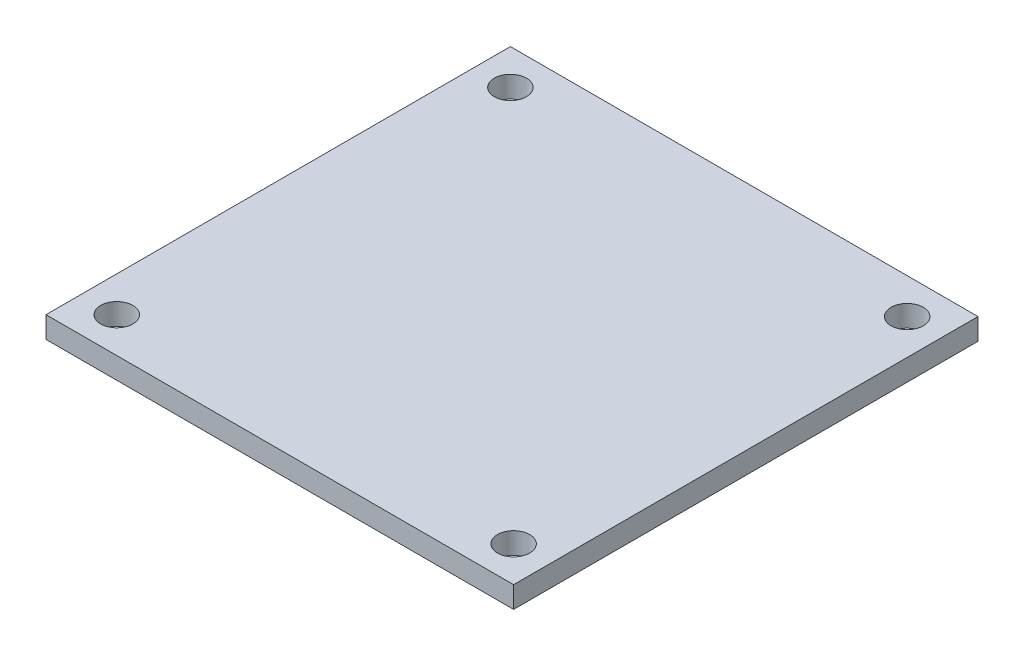
ISO-10303-21;
HEADER;
FILE_DESCRIPTION(('STEP AP214'),'2;1');
FILE_NAME('part.step','',(''),(''),'','','');
FILE_SCHEMA(('AUTOMOTIVE_DESIGN { 1 0 10303 214 1 1 1 1 }'));
ENDSEC;
DATA;
#1=APPLICATION_CONTEXT('core data for automotive mechanical design processes');
#2=APPLICATION_PROTOCOL_DEFINITION('international standard','automotive_design',2000,#1);
#3=PRODUCT_CONTEXT('',#1,'mechanical');
#4=PRODUCT('Part','Part','',(#3));
#5=PRODUCT_RELATED_PRODUCT_CATEGORY('part','',(#4));
#6=PRODUCT_DEFINITION_FORMATION('','',#4);
#7=PRODUCT_DEFINITION_CONTEXT('part definition',#1,'design');
#8=PRODUCT_DEFINITION('design','',#6,#7);
#9=PRODUCT_DEFINITION_SHAPE('','',#8);
#10=(LENGTH_UNIT() NAMED_UNIT(*) SI_UNIT(.MILLI.,.METRE.));
#11=(NAMED_UNIT(*) PLANE_ANGLE_UNIT() SI_UNIT($,.RADIAN.));
#12=(NAMED_UNIT(*) SI_UNIT($,.STERADIAN.) SOLID_ANGLE_UNIT());
#13=UNCERTAINTY_MEASURE_WITH_UNIT(LENGTH_MEASURE(1.E-05),#10,'distance_accuracy_value','');
#14=(GEOMETRIC_REPRESENTATION_CONTEXT(3) GLOBAL_UNCERTAINTY_ASSIGNED_CONTEXT((#13)) GLOBAL_UNIT_ASSIGNED_CONTEXT((#10,
#11,#12)) REPRESENTATION_CONTEXT('',''));
#15=CARTESIAN_POINT('',(0.,0.,0.));
#16=DIRECTION('',(0.,0.,1.));
#17=DIRECTION('',(1.,0.,0.));
#18=AXIS2_PLACEMENT_3D('',#15,#16,#17);
#19=CARTESIAN_POINT('',(0.,2.,0.));
#20=DIRECTION('',(0.,-1.,0.));
#21=DIRECTION('',(0.,0.,-1.));
#22=AXIS2_PLACEMENT_3D('',#19,#20,#21);
#23=PLANE('',#22);
#24=DIRECTION('',(0.,0.,1.));
#25=VECTOR('',#24,1.);
#26=CARTESIAN_POINT('',(0.,2.,0.));
#27=LINE('',#26,#25);
#28=CARTESIAN_POINT('',(0.,2.,-43.3));
#29=VERTEX_POINT('',#28);
#30=CARTESIAN_POINT('',(0.,2.,0.));
#31=VERTEX_POINT('',#30);
#32=EDGE_CURVE('E85',#29,#31,#27,.T.);
#33=ORIENTED_EDGE('',*,*,#32,.T.);
#34=DIRECTION('',(1.,0.,0.));
#35=VECTOR('',#34,1.);
#36=CARTESIAN_POINT('',(0.,2.,0.));
#37=LINE('',#36,#35);
#38=CARTESIAN_POINT('',(43.6,2.,0.));
#39=VERTEX_POINT('',#38);
#40=EDGE_CURVE('E80',#31,#39,#37,.T.);
#41=ORIENTED_EDGE('',*,*,#40,.T.);
#42=DIRECTION('',(0.,0.,-1.));
#43=VECTOR('',#42,1.);
#44=CARTESIAN_POINT('',(43.6,2.,0.));
#45=LINE('',#44,#43);
#46=CARTESIAN_POINT('',(43.6,2.,-43.3));
#47=VERTEX_POINT('',#46);
#48=EDGE_CURVE('E83',#39,#47,#45,.T.);
#49=ORIENTED_EDGE('',*,*,#48,.T.);
#50=DIRECTION('',(-1.,0.,0.));
#51=VECTOR('',#50,1.);
#52=CARTESIAN_POINT('',(0.,2.,-43.3));
#53=LINE('',#52,#51);
#54=EDGE_CURVE('E50',#47,#29,#53,.T.);
#55=ORIENTED_EDGE('',*,*,#54,.T.);
#56=EDGE_LOOP('',(#33,#41,#49,#55));
#57=FACE_BOUND('',#56,.T.);
#58=CARTESIAN_POINT('',(3.3,2.,-40.));
#59=DIRECTION('',(0.,1.,0.));
#60=DIRECTION('',(0.,0.,1.));
#61=AXIS2_PLACEMENT_3D('',#58,#59,#60);
#62=CIRCLE('',#61,1.5);
#63=CARTESIAN_POINT('',(3.3,2.,-38.5));
#64=VERTEX_POINT('',#63);
#65=EDGE_CURVE('E100',#64,#64,#62,.T.);
#66=ORIENTED_EDGE('',*,*,#65,.F.);
#67=EDGE_LOOP('',(#66));
#68=FACE_BOUND('',#67,.T.);
#69=CARTESIAN_POINT('',(40.3,2.,-40.));
#70=DIRECTION('',(0.,1.,0.));
#71=DIRECTION('',(0.,0.,-1.));
#72=AXIS2_PLACEMENT_3D('',#69,#70,#71);
#73=CIRCLE('',#72,1.5);
#74=CARTESIAN_POINT('',(40.3,2.,-41.5));
#75=VERTEX_POINT('',#74);
#76=EDGE_CURVE('E115',#75,#75,#73,.T.);
#77=ORIENTED_EDGE('',*,*,#76,.F.);
#78=EDGE_LOOP('',(#77));
#79=FACE_BOUND('',#78,.T.);
#80=CARTESIAN_POINT('',(40.3,2.,-3.3));
#81=DIRECTION('',(0.,1.,0.));
#82=DIRECTION('',(0.,0.,1.));
#83=AXIS2_PLACEMENT_3D('',#80,#81,#82);
#84=CIRCLE('',#83,1.5);
#85=CARTESIAN_POINT('',(40.3,2.,-1.80000000000001));
#86=VERTEX_POINT('',#85);
#87=EDGE_CURVE('E121',#86,#86,#84,.T.);
#88=ORIENTED_EDGE('',*,*,#87,.F.);
#89=EDGE_LOOP('',(#88));
#90=FACE_BOUND('',#89,.T.);
#91=CARTESIAN_POINT('',(3.30000000000001,2.,-3.3));
#92=DIRECTION('',(0.,1.,0.));
#93=DIRECTION('',(0.,0.,-1.));
#94=AXIS2_PLACEMENT_3D('',#91,#92,#93);
#95=CIRCLE('',#94,1.5);
#96=CARTESIAN_POINT('',(3.30000000000001,2.,-4.8));
#97=VERTEX_POINT('',#96);
#98=EDGE_CURVE('E127',#97,#97,#95,.T.);
#99=ORIENTED_EDGE('',*,*,#98,.F.);
#100=EDGE_LOOP('',(#99));
#101=FACE_BOUND('',#100,.T.);
#102=ADVANCED_FACE('F33',(#57,#68,#79,#90,#101),#23,.F.);
#103=CARTESIAN_POINT('',(0.,0.,0.));
#104=DIRECTION('',(0.,-1.,0.));
#105=DIRECTION('',(0.,0.,-1.));
#106=AXIS2_PLACEMENT_3D('',#103,#104,#105);
#107=PLANE('',#106);
#108=CARTESIAN_POINT('',(40.3,0.,-3.3));
#109=DIRECTION('',(0.,1.,0.));
#110=DIRECTION('',(0.,0.,1.));
#111=AXIS2_PLACEMENT_3D('',#108,#109,#110);
#112=CIRCLE('',#111,1.5);
#113=CARTESIAN_POINT('',(40.3,0.,-1.80000000000001));
#114=VERTEX_POINT('',#113);
#115=EDGE_CURVE('E124',#114,#114,#112,.T.);
#116=ORIENTED_EDGE('',*,*,#115,.T.);
#117=EDGE_LOOP('',(#116));
#118=FACE_BOUND('',#117,.T.);
#119=CARTESIAN_POINT('',(3.3,0.,-40.));
#120=DIRECTION('',(0.,1.,0.));
#121=DIRECTION('',(0.,0.,1.));
#122=AXIS2_PLACEMENT_3D('',#119,#120,#121);
#123=CIRCLE('',#122,1.5);
#124=CARTESIAN_POINT('',(3.3,0.,-38.5));
#125=VERTEX_POINT('',#124);
#126=EDGE_CURVE('E112',#125,#125,#123,.T.);
#127=ORIENTED_EDGE('',*,*,#126,.T.);
#128=EDGE_LOOP('',(#127));
#129=FACE_BOUND('',#128,.T.);
#130=DIRECTION('',(0.,0.,1.));
#131=VECTOR('',#130,1.);
#132=CARTESIAN_POINT('',(0.,0.,0.));
#133=LINE('',#132,#131);
#134=CARTESIAN_POINT('',(0.,0.,-43.3));
#135=VERTEX_POINT('',#134);
#136=CARTESIAN_POINT('',(0.,0.,0.));
#137=VERTEX_POINT('',#136);
#138=EDGE_CURVE('E97',#135,#137,#133,.T.);
#139=ORIENTED_EDGE('',*,*,#138,.F.);
#140=DIRECTION('',(-1.,0.,0.));
#141=VECTOR('',#140,1.);
#142=CARTESIAN_POINT('',(0.,0.,-43.3));
#143=LINE('',#142,#141);
#144=CARTESIAN_POINT('',(43.6,0.,-43.3));
#145=VERTEX_POINT('',#144);
#146=EDGE_CURVE('E73',#145,#135,#143,.T.);
#147=ORIENTED_EDGE('',*,*,#146,.F.);
#148=DIRECTION('',(0.,0.,-1.));
#149=VECTOR('',#148,1.);
#150=CARTESIAN_POINT('',(43.6,0.,0.));
#151=LINE('',#150,#149);
#152=CARTESIAN_POINT('',(43.6,0.,0.));
#153=VERTEX_POINT('',#152);
#154=EDGE_CURVE('E67',#153,#145,#151,.T.);
#155=ORIENTED_EDGE('',*,*,#154,.F.);
#156=DIRECTION('',(1.,0.,0.));
#157=VECTOR('',#156,1.);
#158=CARTESIAN_POINT('',(0.,0.,0.));
#159=LINE('',#158,#157);
#160=EDGE_CURVE('E89',#137,#153,#159,.T.);
#161=ORIENTED_EDGE('',*,*,#160,.F.);
#162=EDGE_LOOP('',(#139,#147,#155,#161));
#163=FACE_BOUND('',#162,.T.);
#164=CARTESIAN_POINT('',(40.3,0.,-40.));
#165=DIRECTION('',(0.,1.,0.));
#166=DIRECTION('',(0.,0.,-1.));
#167=AXIS2_PLACEMENT_3D('',#164,#165,#166);
#168=CIRCLE('',#167,1.5);
#169=CARTESIAN_POINT('',(40.3,0.,-41.5));
#170=VERTEX_POINT('',#169);
#171=EDGE_CURVE('E118',#170,#170,#168,.T.);
#172=ORIENTED_EDGE('',*,*,#171,.T.);
#173=EDGE_LOOP('',(#172));
#174=FACE_BOUND('',#173,.T.);
#175=CARTESIAN_POINT('',(3.30000000000001,0.,-3.3));
#176=DIRECTION('',(0.,1.,0.));
#177=DIRECTION('',(0.,0.,-1.));
#178=AXIS2_PLACEMENT_3D('',#175,#176,#177);
#179=CIRCLE('',#178,1.5);
#180=CARTESIAN_POINT('',(3.30000000000001,0.,-4.8));
#181=VERTEX_POINT('',#180);
#182=EDGE_CURVE('E130',#181,#181,#179,.T.);
#183=ORIENTED_EDGE('',*,*,#182,.T.);
#184=EDGE_LOOP('',(#183));
#185=FACE_BOUND('',#184,.T.);
#186=ADVANCED_FACE('F108',(#118,#129,#163,#174,#185),#107,.T.);
#187=CARTESIAN_POINT('',(0.,2.,0.));
#188=DIRECTION('',(1.,0.,0.));
#189=DIRECTION('',(0.,0.,-1.));
#190=AXIS2_PLACEMENT_3D('',#187,#188,#189);
#191=PLANE('',#190);
#192=ORIENTED_EDGE('',*,*,#138,.T.);
#193=DIRECTION('',(0.,-1.,0.));
#194=VECTOR('',#193,1.);
#195=CARTESIAN_POINT('',(0.,2.,0.));
#196=LINE('',#195,#194);
#197=EDGE_CURVE('E11',#31,#137,#196,.T.);
#198=ORIENTED_EDGE('',*,*,#197,.F.);
#199=ORIENTED_EDGE('',*,*,#32,.F.);
#200=DIRECTION('',(0.,-1.,0.));
#201=VECTOR('',#200,1.);
#202=CARTESIAN_POINT('',(0.,2.,-43.3));
#203=LINE('',#202,#201);
#204=EDGE_CURVE('E93',#29,#135,#203,.T.);
#205=ORIENTED_EDGE('',*,*,#204,.T.);
#206=EDGE_LOOP('',(#192,#198,#199,#205));
#207=FACE_BOUND('',#206,.T.);
#208=ADVANCED_FACE('F35',(#207),#191,.F.);
#209=CARTESIAN_POINT('',(0.,2.,0.));
#210=DIRECTION('',(0.,0.,-1.));
#211=DIRECTION('',(-1.,0.,0.));
#212=AXIS2_PLACEMENT_3D('',#209,#210,#211);
#213=PLANE('',#212);
#214=ORIENTED_EDGE('',*,*,#160,.T.);
#215=DIRECTION('',(0.,-1.,0.));
#216=VECTOR('',#215,1.);
#217=CARTESIAN_POINT('',(43.6,2.,0.));
#218=LINE('',#217,#216);
#219=EDGE_CURVE('E42',#39,#153,#218,.T.);
#220=ORIENTED_EDGE('',*,*,#219,.F.);
#221=ORIENTED_EDGE('',*,*,#40,.F.);
#222=ORIENTED_EDGE('',*,*,#197,.T.);
#223=EDGE_LOOP('',(#214,#220,#221,#222));
#224=FACE_BOUND('',#223,.T.);
#225=ADVANCED_FACE('F88',(#224),#213,.F.);
#226=CARTESIAN_POINT('',(43.6,2.,0.));
#227=DIRECTION('',(-1.,0.,0.));
#228=DIRECTION('',(0.,0.,1.));
#229=AXIS2_PLACEMENT_3D('',#226,#227,#228);
#230=PLANE('',#229);
#231=ORIENTED_EDGE('',*,*,#154,.T.);
#232=DIRECTION('',(0.,-1.,0.));
#233=VECTOR('',#232,1.);
#234=CARTESIAN_POINT('',(43.6,2.,-43.3));
#235=LINE('',#234,#233);
#236=EDGE_CURVE('E90',#47,#145,#235,.T.);
#237=ORIENTED_EDGE('',*,*,#236,.F.);
#238=ORIENTED_EDGE('',*,*,#48,.F.);
#239=ORIENTED_EDGE('',*,*,#219,.T.);
#240=EDGE_LOOP('',(#231,#237,#238,#239));
#241=FACE_BOUND('',#240,.T.);
#242=ADVANCED_FACE('F91',(#241),#230,.F.);
#243=CARTESIAN_POINT('',(0.,2.,-43.3));
#244=DIRECTION('',(0.,0.,1.));
#245=DIRECTION('',(1.,0.,0.));
#246=AXIS2_PLACEMENT_3D('',#243,#244,#245);
#247=PLANE('',#246);
#248=ORIENTED_EDGE('',*,*,#146,.T.);
#249=ORIENTED_EDGE('',*,*,#204,.F.);
#250=ORIENTED_EDGE('',*,*,#54,.F.);
#251=ORIENTED_EDGE('',*,*,#236,.T.);
#252=EDGE_LOOP('',(#248,#249,#250,#251));
#253=FACE_BOUND('',#252,.T.);
#254=ADVANCED_FACE('F105',(#253),#247,.F.);
#255=CARTESIAN_POINT('',(3.3,2.,-40.));
#256=DIRECTION('',(0.,-1.,0.));
#257=DIRECTION('',(0.,0.,-1.));
#258=AXIS2_PLACEMENT_3D('',#255,#256,#257);
#259=CYLINDRICAL_SURFACE('',#258,1.5);
#260=ORIENTED_EDGE('',*,*,#65,.T.);
#261=EDGE_LOOP('',(#260));
#262=FACE_BOUND('',#261,.T.);
#263=ORIENTED_EDGE('',*,*,#126,.F.);
#264=EDGE_LOOP('',(#263));
#265=FACE_BOUND('',#264,.T.);
#266=ADVANCED_FACE('F147',(#262,#265),#259,.F.);
#267=CARTESIAN_POINT('',(40.3,2.,-40.));
#268=DIRECTION('',(0.,-1.,0.));
#269=DIRECTION('',(0.,0.,-1.));
#270=AXIS2_PLACEMENT_3D('',#267,#268,#269);
#271=CYLINDRICAL_SURFACE('',#270,1.5);
#272=ORIENTED_EDGE('',*,*,#76,.T.);
#273=EDGE_LOOP('',(#272));
#274=FACE_BOUND('',#273,.T.);
#275=ORIENTED_EDGE('',*,*,#171,.F.);
#276=EDGE_LOOP('',(#275));
#277=FACE_BOUND('',#276,.T.);
#278=ADVANCED_FACE('F193',(#274,#277),#271,.F.);
#279=CARTESIAN_POINT('',(40.3,2.,-3.3));
#280=DIRECTION('',(0.,-1.,0.));
#281=DIRECTION('',(0.,0.,-1.));
#282=AXIS2_PLACEMENT_3D('',#279,#280,#281);
#283=CYLINDRICAL_SURFACE('',#282,1.5);
#284=ORIENTED_EDGE('',*,*,#87,.T.);
#285=EDGE_LOOP('',(#284));
#286=FACE_BOUND('',#285,.T.);
#287=ORIENTED_EDGE('',*,*,#115,.F.);
#288=EDGE_LOOP('',(#287));
#289=FACE_BOUND('',#288,.T.);
#290=ADVANCED_FACE('F201',(#286,#289),#283,.F.);
#291=CARTESIAN_POINT('',(3.30000000000001,2.,-3.3));
#292=DIRECTION('',(0.,-1.,0.));
#293=DIRECTION('',(0.,0.,-1.));
#294=AXIS2_PLACEMENT_3D('',#291,#292,#293);
#295=CYLINDRICAL_SURFACE('',#294,1.5);
#296=ORIENTED_EDGE('',*,*,#98,.T.);
#297=EDGE_LOOP('',(#296));
#298=FACE_BOUND('',#297,.T.);
#299=ORIENTED_EDGE('',*,*,#182,.F.);
#300=EDGE_LOOP('',(#299));
#301=FACE_BOUND('',#300,.T.);
#302=ADVANCED_FACE('F136',(#298,#301),#295,.F.);
#303=CLOSED_SHELL('',(#102,#186,#208,#225,#242,#254,#266,#278,#290,#302));
#304=MANIFOLD_SOLID_BREP('B2',#303);
#305=ADVANCED_BREP_SHAPE_REPRESENTATION('',(#18,#304),#14);
#306=SHAPE_DEFINITION_REPRESENTATION(#9,#305);
ENDSEC;
END-ISO-10303-21;
